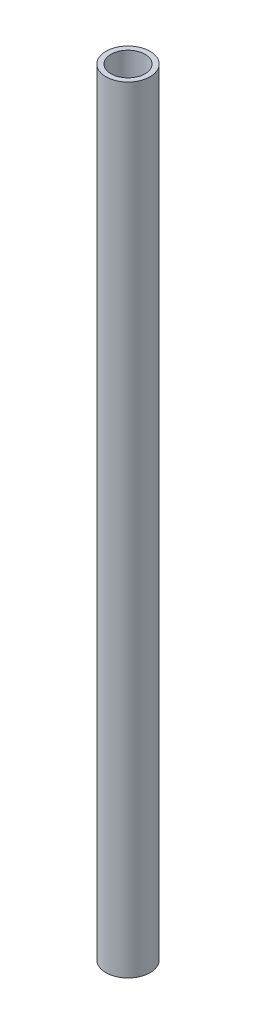
ISO-10303-21;
HEADER;
FILE_DESCRIPTION(('STEP AP214'),'2;1');
FILE_NAME('part.step','',(''),(''),'','','');
FILE_SCHEMA(('AUTOMOTIVE_DESIGN { 1 0 10303 214 1 1 1 1 }'));
ENDSEC;
DATA;
#1=APPLICATION_CONTEXT('core data for automotive mechanical design processes');
#2=APPLICATION_PROTOCOL_DEFINITION('international standard','automotive_design',2000,#1);
#3=PRODUCT_CONTEXT('',#1,'mechanical');
#4=PRODUCT('Part','Part','',(#3));
#5=PRODUCT_RELATED_PRODUCT_CATEGORY('part','',(#4));
#6=PRODUCT_DEFINITION_FORMATION('','',#4);
#7=PRODUCT_DEFINITION_CONTEXT('part definition',#1,'design');
#8=PRODUCT_DEFINITION('design','',#6,#7);
#9=PRODUCT_DEFINITION_SHAPE('','',#8);
#10=(LENGTH_UNIT() NAMED_UNIT(*) SI_UNIT(.MILLI.,.METRE.));
#11=(NAMED_UNIT(*) PLANE_ANGLE_UNIT() SI_UNIT($,.RADIAN.));
#12=(NAMED_UNIT(*) SI_UNIT($,.STERADIAN.) SOLID_ANGLE_UNIT());
#13=UNCERTAINTY_MEASURE_WITH_UNIT(LENGTH_MEASURE(1.E-05),#10,'distance_accuracy_value','');
#14=(GEOMETRIC_REPRESENTATION_CONTEXT(3) GLOBAL_UNCERTAINTY_ASSIGNED_CONTEXT((#13)) GLOBAL_UNIT_ASSIGNED_CONTEXT((#10,
#11,#12)) REPRESENTATION_CONTEXT('',''));
#15=CARTESIAN_POINT('',(0.,0.,0.));
#16=DIRECTION('',(0.,0.,1.));
#17=DIRECTION('',(1.,0.,0.));
#18=AXIS2_PLACEMENT_3D('',#15,#16,#17);
#19=CARTESIAN_POINT('',(0.,228.4,0.));
#20=DIRECTION('',(0.,-1.,0.));
#21=DIRECTION('',(0.,0.,-1.));
#22=AXIS2_PLACEMENT_3D('',#19,#20,#21);
#23=CYLINDRICAL_SURFACE('',#22,3.5);
#24=CARTESIAN_POINT('',(0.,31.,0.));
#25=DIRECTION('',(0.,1.,0.));
#26=DIRECTION('',(0.,0.,1.));
#27=AXIS2_PLACEMENT_3D('',#24,#25,#26);
#28=CIRCLE('',#27,3.5);
#29=CARTESIAN_POINT('',(0.,31.,3.5));
#30=VERTEX_POINT('',#29);
#31=EDGE_CURVE('E41',#30,#30,#28,.T.);
#32=ORIENTED_EDGE('',*,*,#31,.F.);
#33=EDGE_LOOP('',(#32));
#34=FACE_BOUND('',#33,.T.);
#35=CARTESIAN_POINT('',(0.,197.4,0.));
#36=DIRECTION('',(0.,1.,0.));
#37=DIRECTION('',(0.,0.,1.));
#38=AXIS2_PLACEMENT_3D('',#35,#36,#37);
#39=CIRCLE('',#38,3.5);
#40=CARTESIAN_POINT('',(0.,197.4,3.5));
#41=VERTEX_POINT('',#40);
#42=EDGE_CURVE('E52',#41,#41,#39,.T.);
#43=ORIENTED_EDGE('',*,*,#42,.T.);
#44=EDGE_LOOP('',(#43));
#45=FACE_BOUND('',#44,.T.);
#46=ADVANCED_FACE('F37',(#34,#45),#23,.F.);
#47=CARTESIAN_POINT('',(0.,228.4,0.));
#48=DIRECTION('',(0.,1.,0.));
#49=DIRECTION('',(0.,0.,1.));
#50=AXIS2_PLACEMENT_3D('',#47,#48,#49);
#51=PLANE('',#50);
#52=CARTESIAN_POINT('',(0.,228.4,0.));
#53=DIRECTION('',(0.,1.,0.));
#54=DIRECTION('',(0.,0.,1.));
#55=AXIS2_PLACEMENT_3D('',#52,#53,#54);
#56=CIRCLE('',#55,5.);
#57=CARTESIAN_POINT('',(0.,228.4,5.));
#58=VERTEX_POINT('',#57);
#59=EDGE_CURVE('E55',#58,#58,#56,.T.);
#60=ORIENTED_EDGE('',*,*,#59,.F.);
#61=EDGE_LOOP('',(#60));
#62=FACE_BOUND('',#61,.T.);
#63=CARTESIAN_POINT('',(0.,228.4,0.));
#64=DIRECTION('',(0.,1.,0.));
#65=DIRECTION('',(0.,0.,1.));
#66=AXIS2_PLACEMENT_3D('',#63,#64,#65);
#67=CIRCLE('',#66,6.5);
#68=CARTESIAN_POINT('',(0.,228.4,6.5));
#69=VERTEX_POINT('',#68);
#70=EDGE_CURVE('E10',#69,#69,#67,.T.);
#71=ORIENTED_EDGE('',*,*,#70,.T.);
#72=EDGE_LOOP('',(#71));
#73=FACE_BOUND('',#72,.T.);
#74=ADVANCED_FACE('F86',(#62,#73),#51,.T.);
#75=CARTESIAN_POINT('',(0.,0.,0.));
#76=DIRECTION('',(0.,1.,0.));
#77=DIRECTION('',(0.,0.,1.));
#78=AXIS2_PLACEMENT_3D('',#75,#76,#77);
#79=PLANE('',#78);
#80=CARTESIAN_POINT('',(0.,0.,0.));
#81=DIRECTION('',(0.,1.,0.));
#82=DIRECTION('',(0.,0.,1.));
#83=AXIS2_PLACEMENT_3D('',#80,#81,#82);
#84=CIRCLE('',#83,5.);
#85=CARTESIAN_POINT('',(0.,0.,5.));
#86=VERTEX_POINT('',#85);
#87=EDGE_CURVE('E69',#86,#86,#84,.T.);
#88=ORIENTED_EDGE('',*,*,#87,.T.);
#89=EDGE_LOOP('',(#88));
#90=FACE_BOUND('',#89,.T.);
#91=CARTESIAN_POINT('',(0.,0.,0.));
#92=DIRECTION('',(0.,1.,0.));
#93=DIRECTION('',(0.,0.,1.));
#94=AXIS2_PLACEMENT_3D('',#91,#92,#93);
#95=CIRCLE('',#94,6.5);
#96=CARTESIAN_POINT('',(0.,0.,6.5));
#97=VERTEX_POINT('',#96);
#98=EDGE_CURVE('E46',#97,#97,#95,.T.);
#99=ORIENTED_EDGE('',*,*,#98,.F.);
#100=EDGE_LOOP('',(#99));
#101=FACE_BOUND('',#100,.T.);
#102=ADVANCED_FACE('F91',(#90,#101),#79,.F.);
#103=CARTESIAN_POINT('',(0.,228.4,0.));
#104=DIRECTION('',(0.,-1.,0.));
#105=DIRECTION('',(0.,0.,-1.));
#106=AXIS2_PLACEMENT_3D('',#103,#104,#105);
#107=CYLINDRICAL_SURFACE('',#106,6.5);
#108=ORIENTED_EDGE('',*,*,#70,.F.);
#109=EDGE_LOOP('',(#108));
#110=FACE_BOUND('',#109,.T.);
#111=ORIENTED_EDGE('',*,*,#98,.T.);
#112=EDGE_LOOP('',(#111));
#113=FACE_BOUND('',#112,.T.);
#114=ADVANCED_FACE('F39',(#110,#113),#107,.T.);
#115=CARTESIAN_POINT('',(0.,197.4,0.));
#116=DIRECTION('',(0.,1.,0.));
#117=DIRECTION('',(0.,0.,1.));
#118=AXIS2_PLACEMENT_3D('',#115,#116,#117);
#119=CYLINDRICAL_SURFACE('',#118,5.);
#120=CARTESIAN_POINT('',(0.,197.4,0.));
#121=DIRECTION('',(0.,1.,0.));
#122=DIRECTION('',(0.,0.,1.));
#123=AXIS2_PLACEMENT_3D('',#120,#121,#122);
#124=CIRCLE('',#123,5.);
#125=CARTESIAN_POINT('',(0.,197.4,5.));
#126=VERTEX_POINT('',#125);
#127=EDGE_CURVE('E59',#126,#126,#124,.T.);
#128=ORIENTED_EDGE('',*,*,#127,.F.);
#129=EDGE_LOOP('',(#128));
#130=FACE_BOUND('',#129,.T.);
#131=ORIENTED_EDGE('',*,*,#59,.T.);
#132=EDGE_LOOP('',(#131));
#133=FACE_BOUND('',#132,.T.);
#134=ADVANCED_FACE('F95',(#130,#133),#119,.F.);
#135=CARTESIAN_POINT('',(0.,197.4,0.));
#136=DIRECTION('',(0.,1.,0.));
#137=DIRECTION('',(0.,0.,1.));
#138=AXIS2_PLACEMENT_3D('',#135,#136,#137);
#139=PLANE('',#138);
#140=ORIENTED_EDGE('',*,*,#42,.F.);
#141=EDGE_LOOP('',(#140));
#142=FACE_BOUND('',#141,.T.);
#143=ORIENTED_EDGE('',*,*,#127,.T.);
#144=EDGE_LOOP('',(#143));
#145=FACE_BOUND('',#144,.T.);
#146=ADVANCED_FACE('F110',(#142,#145),#139,.T.);
#147=CARTESIAN_POINT('',(0.,31.,0.));
#148=DIRECTION('',(0.,-1.,0.));
#149=DIRECTION('',(0.,0.,-1.));
#150=AXIS2_PLACEMENT_3D('',#147,#148,#149);
#151=CYLINDRICAL_SURFACE('',#150,5.);
#152=CARTESIAN_POINT('',(0.,31.,0.));
#153=DIRECTION('',(0.,1.,0.));
#154=DIRECTION('',(0.,0.,1.));
#155=AXIS2_PLACEMENT_3D('',#152,#153,#154);
#156=CIRCLE('',#155,5.);
#157=CARTESIAN_POINT('',(0.,31.,5.));
#158=VERTEX_POINT('',#157);
#159=EDGE_CURVE('E73',#158,#158,#156,.T.);
#160=ORIENTED_EDGE('',*,*,#159,.T.);
#161=EDGE_LOOP('',(#160));
#162=FACE_BOUND('',#161,.T.);
#163=ORIENTED_EDGE('',*,*,#87,.F.);
#164=EDGE_LOOP('',(#163));
#165=FACE_BOUND('',#164,.T.);
#166=ADVANCED_FACE('F108',(#162,#165),#151,.F.);
#167=CARTESIAN_POINT('',(0.,31.,0.));
#168=DIRECTION('',(0.,1.,0.));
#169=DIRECTION('',(0.,0.,1.));
#170=AXIS2_PLACEMENT_3D('',#167,#168,#169);
#171=PLANE('',#170);
#172=ORIENTED_EDGE('',*,*,#31,.T.);
#173=EDGE_LOOP('',(#172));
#174=FACE_BOUND('',#173,.T.);
#175=ORIENTED_EDGE('',*,*,#159,.F.);
#176=EDGE_LOOP('',(#175));
#177=FACE_BOUND('',#176,.T.);
#178=ADVANCED_FACE('F82',(#174,#177),#171,.F.);
#179=CLOSED_SHELL('',(#46,#74,#102,#114,#134,#146,#166,#178));
#180=MANIFOLD_SOLID_BREP('B2',#179);
#181=ADVANCED_BREP_SHAPE_REPRESENTATION('',(#18,#180),#14);
#182=SHAPE_DEFINITION_REPRESENTATION(#9,#181);
ENDSEC;
END-ISO-10303-21;
